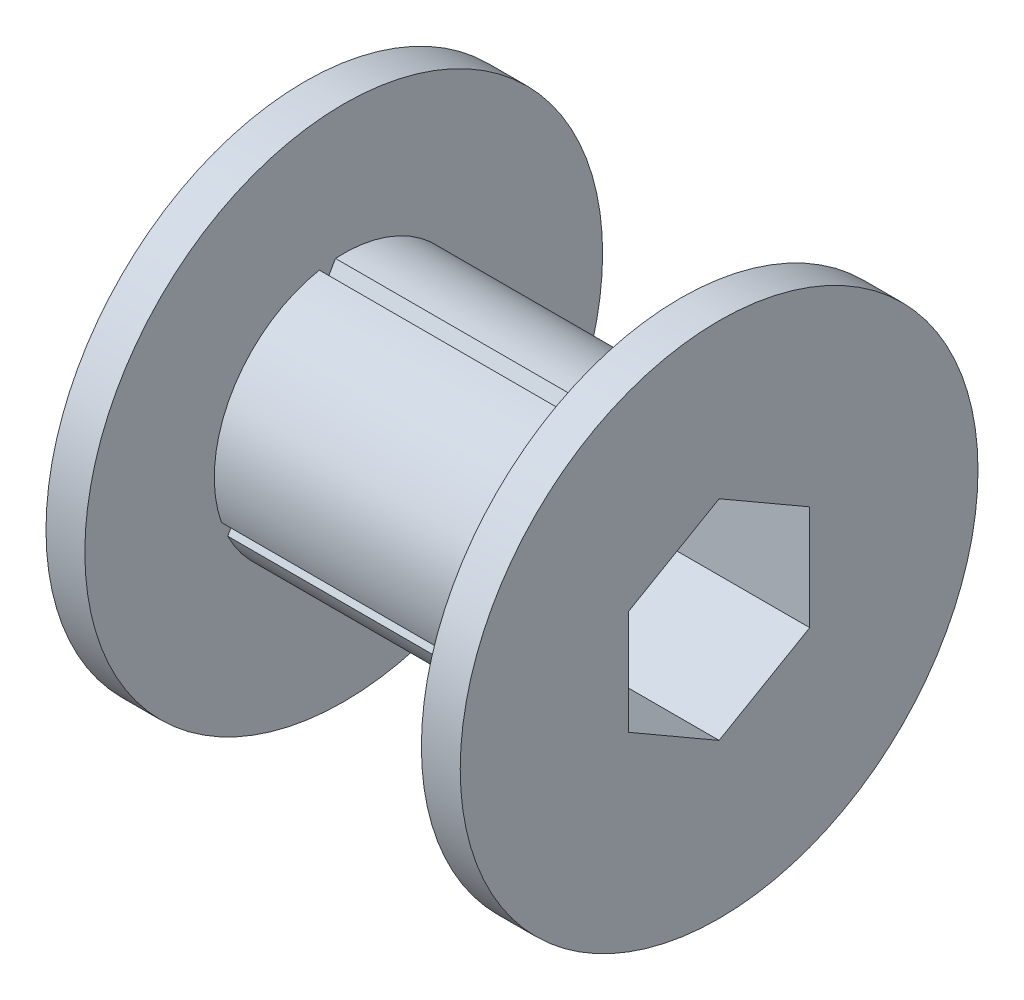
ISO-10303-21;
HEADER;
FILE_DESCRIPTION(('STEP AP214'),'2;1');
FILE_NAME('part.step','',(''),(''),'','','');
FILE_SCHEMA(('AUTOMOTIVE_DESIGN { 1 0 10303 214 1 1 1 1 }'));
ENDSEC;
DATA;
#1=APPLICATION_CONTEXT('core data for automotive mechanical design processes');
#2=APPLICATION_PROTOCOL_DEFINITION('international standard','automotive_design',2000,#1);
#3=PRODUCT_CONTEXT('',#1,'mechanical');
#4=PRODUCT('Part','Part','',(#3));
#5=PRODUCT_RELATED_PRODUCT_CATEGORY('part','',(#4));
#6=PRODUCT_DEFINITION_FORMATION('','',#4);
#7=PRODUCT_DEFINITION_CONTEXT('part definition',#1,'design');
#8=PRODUCT_DEFINITION('design','',#6,#7);
#9=PRODUCT_DEFINITION_SHAPE('','',#8);
#10=(LENGTH_UNIT() NAMED_UNIT(*) SI_UNIT(.MILLI.,.METRE.));
#11=(NAMED_UNIT(*) PLANE_ANGLE_UNIT() SI_UNIT($,.RADIAN.));
#12=(NAMED_UNIT(*) SI_UNIT($,.STERADIAN.) SOLID_ANGLE_UNIT());
#13=UNCERTAINTY_MEASURE_WITH_UNIT(LENGTH_MEASURE(1.E-05),#10,'distance_accuracy_value','');
#14=(GEOMETRIC_REPRESENTATION_CONTEXT(3) GLOBAL_UNCERTAINTY_ASSIGNED_CONTEXT((#13)) GLOBAL_UNIT_ASSIGNED_CONTEXT((#10,
#11,#12)) REPRESENTATION_CONTEXT('',''));
#15=CARTESIAN_POINT('',(0.,0.,0.));
#16=DIRECTION('',(0.,0.,1.));
#17=DIRECTION('',(1.,0.,0.));
#18=AXIS2_PLACEMENT_3D('',#15,#16,#17);
#19=CARTESIAN_POINT('',(4.,0.,0.));
#20=DIRECTION('',(-1.,0.,0.));
#21=DIRECTION('',(0.,0.,1.));
#22=AXIS2_PLACEMENT_3D('',#19,#20,#21);
#23=CYLINDRICAL_SURFACE('',#22,2.5);
#24=DIRECTION('',(-1.,0.,0.));
#25=VECTOR('',#24,1.);
#26=CARTESIAN_POINT('',(4.,2.49492372196933,0.159234486072311));
#27=LINE('',#26,#25);
#28=CARTESIAN_POINT('',(3.25,2.49492372196933,0.159234486072312));
#29=VERTEX_POINT('',#28);
#30=CARTESIAN_POINT('',(-3.25,2.49492372196933,0.159234486072311));
#31=VERTEX_POINT('',#30);
#32=EDGE_CURVE('E166',#29,#31,#27,.T.);
#33=ORIENTED_EDGE('',*,*,#32,.F.);
#34=CARTESIAN_POINT('',(3.25,0.,0.));
#35=DIRECTION('',(1.,0.,0.));
#36=DIRECTION('',(0.,0.,-1.));
#37=AXIS2_PLACEMENT_3D('',#34,#35,#36);
#38=CIRCLE('',#37,2.5);
#39=CARTESIAN_POINT('',(3.25,-1.10956075088748,2.24028456676602));
#40=VERTEX_POINT('',#39);
#41=EDGE_CURVE('E228',#40,#29,#38,.T.);
#42=ORIENTED_EDGE('',*,*,#41,.F.);
#43=DIRECTION('',(-1.,0.,0.));
#44=VECTOR('',#43,1.);
#45=CARTESIAN_POINT('',(4.,-1.10956075088748,2.24028456676602));
#46=LINE('',#45,#44);
#47=CARTESIAN_POINT('',(-3.25,-1.10956075088748,2.24028456676602));
#48=VERTEX_POINT('',#47);
#49=EDGE_CURVE('E160',#48,#40,#46,.F.);
#50=ORIENTED_EDGE('',*,*,#49,.F.);
#51=CARTESIAN_POINT('',(-3.25,0.,0.));
#52=DIRECTION('',(-1.,0.,0.));
#53=DIRECTION('',(0.,0.,1.));
#54=AXIS2_PLACEMENT_3D('',#51,#52,#53);
#55=CIRCLE('',#54,2.5);
#56=EDGE_CURVE('E235',#31,#48,#55,.T.);
#57=ORIENTED_EDGE('',*,*,#56,.F.);
#58=EDGE_LOOP('',(#33,#42,#50,#57));
#59=FACE_BOUND('',#58,.T.);
#60=ADVANCED_FACE('F33',(#59),#23,.T.);
#61=DIRECTION('',(-1.,0.,0.));
#62=VECTOR('',#61,1.);
#63=CARTESIAN_POINT('',(4.,-0.819905447910478,2.36172713421486));
#64=LINE('',#63,#62);
#65=CARTESIAN_POINT('',(3.25,-0.819905447910477,2.36172713421486));
#66=VERTEX_POINT('',#65);
#67=CARTESIAN_POINT('',(-3.25,-0.819905447910479,2.36172713421486));
#68=VERTEX_POINT('',#67);
#69=EDGE_CURVE('E158',#66,#68,#64,.T.);
#70=ORIENTED_EDGE('',*,*,#69,.F.);
#71=CARTESIAN_POINT('',(3.25,2.45526841899232,0.470804620515693));
#72=VERTEX_POINT('',#71);
#73=EDGE_CURVE('E151',#72,#66,#38,.T.);
#74=ORIENTED_EDGE('',*,*,#73,.F.);
#75=DIRECTION('',(-1.,0.,0.));
#76=VECTOR('',#75,1.);
#77=CARTESIAN_POINT('',(4.,2.45526841899233,0.470804620515692));
#78=LINE('',#77,#76);
#79=CARTESIAN_POINT('',(-3.25,2.45526841899233,0.470804620515692));
#80=VERTEX_POINT('',#79);
#81=EDGE_CURVE('E138',#80,#72,#78,.F.);
#82=ORIENTED_EDGE('',*,*,#81,.F.);
#83=EDGE_CURVE('E232',#68,#80,#55,.T.);
#84=ORIENTED_EDGE('',*,*,#83,.F.);
#85=EDGE_LOOP('',(#70,#74,#82,#84));
#86=FACE_BOUND('',#85,.T.);
#87=ADVANCED_FACE('F265',(#86),#23,.T.);
#88=CARTESIAN_POINT('',(-4.,0.,1.75));
#89=DIRECTION('',(0.,0.,1.));
#90=DIRECTION('',(0.,-1.,0.));
#91=AXIS2_PLACEMENT_3D('',#88,#89,#90);
#92=PLANE('',#91);
#93=DIRECTION('',(1.,0.,0.));
#94=VECTOR('',#93,1.);
#95=CARTESIAN_POINT('',(-4.,-1.01036297108192,1.75));
#96=LINE('',#95,#94);
#97=CARTESIAN_POINT('',(-4.,-1.01036297108192,1.75));
#98=VERTEX_POINT('',#97);
#99=CARTESIAN_POINT('',(4.,-1.01036297108192,1.75));
#100=VERTEX_POINT('',#99);
#101=EDGE_CURVE('E212',#98,#100,#96,.T.);
#102=ORIENTED_EDGE('',*,*,#101,.F.);
#103=DIRECTION('',(0.,-1.,0.));
#104=VECTOR('',#103,1.);
#105=CARTESIAN_POINT('',(-4.,1.01036297108184,1.75));
#106=LINE('',#105,#104);
#107=CARTESIAN_POINT('',(-4.,1.01036297108184,1.75));
#108=VERTEX_POINT('',#107);
#109=EDGE_CURVE('E196',#108,#98,#106,.T.);
#110=ORIENTED_EDGE('',*,*,#109,.F.);
#111=DIRECTION('',(1.,0.,0.));
#112=VECTOR('',#111,1.);
#113=CARTESIAN_POINT('',(-4.,1.01036297108184,1.75));
#114=LINE('',#113,#112);
#115=CARTESIAN_POINT('',(4.,1.01036297108184,1.75));
#116=VERTEX_POINT('',#115);
#117=EDGE_CURVE('E214',#108,#116,#114,.T.);
#118=ORIENTED_EDGE('',*,*,#117,.T.);
#119=DIRECTION('',(0.,-1.,0.));
#120=VECTOR('',#119,1.);
#121=CARTESIAN_POINT('',(4.,1.01036297108184,1.75));
#122=LINE('',#121,#120);
#123=EDGE_CURVE('E179',#116,#100,#122,.T.);
#124=ORIENTED_EDGE('',*,*,#123,.T.);
#125=EDGE_LOOP('',(#102,#110,#118,#124));
#126=FACE_BOUND('',#125,.T.);
#127=DIRECTION('',(0.,1.,0.));
#128=VECTOR('',#127,1.);
#129=CARTESIAN_POINT('',(-3.25,0.,1.75));
#130=LINE('',#129,#128);
#131=CARTESIAN_POINT('',(-3.25,-0.260362971081841,1.75));
#132=VERTEX_POINT('',#131);
#133=CARTESIAN_POINT('',(-3.25,0.239637028918158,1.75));
#134=VERTEX_POINT('',#133);
#135=EDGE_CURVE('E168',#132,#134,#130,.T.);
#136=ORIENTED_EDGE('',*,*,#135,.F.);
#137=DIRECTION('',(-1.,0.,0.));
#138=VECTOR('',#137,1.);
#139=CARTESIAN_POINT('',(-4.,-0.26036297108184,1.75));
#140=LINE('',#139,#138);
#141=CARTESIAN_POINT('',(3.25,-0.260362971081838,1.75));
#142=VERTEX_POINT('',#141);
#143=EDGE_CURVE('E157',#142,#132,#140,.T.);
#144=ORIENTED_EDGE('',*,*,#143,.F.);
#145=DIRECTION('',(0.,-1.,0.));
#146=VECTOR('',#145,1.);
#147=CARTESIAN_POINT('',(3.25,0.,1.75));
#148=LINE('',#147,#146);
#149=CARTESIAN_POINT('',(3.25,0.239637028918157,1.75));
#150=VERTEX_POINT('',#149);
#151=EDGE_CURVE('E147',#150,#142,#148,.T.);
#152=ORIENTED_EDGE('',*,*,#151,.F.);
#153=DIRECTION('',(1.,0.,0.));
#154=VECTOR('',#153,1.);
#155=CARTESIAN_POINT('',(-4.,0.239637028918158,1.75));
#156=LINE('',#155,#154);
#157=EDGE_CURVE('E130',#134,#150,#156,.T.);
#158=ORIENTED_EDGE('',*,*,#157,.F.);
#159=EDGE_LOOP('',(#136,#144,#152,#158));
#160=FACE_BOUND('',#159,.T.);
#161=ADVANCED_FACE('F156',(#126,#160),#92,.F.);
#162=CARTESIAN_POINT('',(-4.,1.51554445662277,0.875));
#163=DIRECTION('',(0.,0.866025403784438,0.5));
#164=DIRECTION('',(0.,-0.5,0.866025403784438));
#165=AXIS2_PLACEMENT_3D('',#162,#163,#164);
#166=PLANE('',#165);
#167=ORIENTED_EDGE('',*,*,#117,.F.);
#168=DIRECTION('',(0.,-0.5,0.866025403784439));
#169=VECTOR('',#168,1.);
#170=CARTESIAN_POINT('',(-4.,2.02072594216369,0.));
#171=LINE('',#170,#169);
#172=CARTESIAN_POINT('',(-4.,2.02072594216369,0.));
#173=VERTEX_POINT('',#172);
#174=EDGE_CURVE('E193',#173,#108,#171,.T.);
#175=ORIENTED_EDGE('',*,*,#174,.F.);
#176=DIRECTION('',(1.,0.,0.));
#177=VECTOR('',#176,1.);
#178=CARTESIAN_POINT('',(-4.,2.02072594216369,0.));
#179=LINE('',#178,#177);
#180=CARTESIAN_POINT('',(4.,2.02072594216369,0.));
#181=VERTEX_POINT('',#180);
#182=EDGE_CURVE('E216',#173,#181,#179,.T.);
#183=ORIENTED_EDGE('',*,*,#182,.T.);
#184=DIRECTION('',(0.,-0.5,0.866025403784439));
#185=VECTOR('',#184,1.);
#186=CARTESIAN_POINT('',(4.,2.02072594216369,0.));
#187=LINE('',#186,#185);
#188=EDGE_CURVE('E176',#181,#116,#187,.T.);
#189=ORIENTED_EDGE('',*,*,#188,.T.);
#190=EDGE_LOOP('',(#167,#175,#183,#189));
#191=FACE_BOUND('',#190,.T.);
#192=DIRECTION('',(0.,0.5,-0.866025403784438));
#193=VECTOR('',#192,1.);
#194=CARTESIAN_POINT('',(-3.25,1.51554445662277,0.875));
#195=LINE('',#194,#193);
#196=CARTESIAN_POINT('',(-3.25,1.39572594216369,1.08253175473055));
#197=VERTEX_POINT('',#196);
#198=CARTESIAN_POINT('',(-3.25,1.64572594216369,0.64951905283833));
#199=VERTEX_POINT('',#198);
#200=EDGE_CURVE('E11',#197,#199,#195,.T.);
#201=ORIENTED_EDGE('',*,*,#200,.F.);
#202=DIRECTION('',(-1.,0.,0.));
#203=VECTOR('',#202,1.);
#204=CARTESIAN_POINT('',(-4.,1.39572594216369,1.08253175473055));
#205=LINE('',#204,#203);
#206=CARTESIAN_POINT('',(3.25,1.39572594216369,1.08253175473055));
#207=VERTEX_POINT('',#206);
#208=EDGE_CURVE('E236',#207,#197,#205,.T.);
#209=ORIENTED_EDGE('',*,*,#208,.F.);
#210=DIRECTION('',(0.,-0.5,0.866025403784438));
#211=VECTOR('',#210,1.);
#212=CARTESIAN_POINT('',(3.25,1.51554445662277,0.875));
#213=LINE('',#212,#211);
#214=CARTESIAN_POINT('',(3.25,1.64572594216369,0.649519052838333));
#215=VERTEX_POINT('',#214);
#216=EDGE_CURVE('E238',#215,#207,#213,.T.);
#217=ORIENTED_EDGE('',*,*,#216,.F.);
#218=DIRECTION('',(1.,0.,0.));
#219=VECTOR('',#218,1.);
#220=CARTESIAN_POINT('',(-4.,1.64572594216369,0.649519052838329));
#221=LINE('',#220,#219);
#222=EDGE_CURVE('E40',#199,#215,#221,.T.);
#223=ORIENTED_EDGE('',*,*,#222,.F.);
#224=EDGE_LOOP('',(#201,#209,#217,#223));
#225=FACE_BOUND('',#224,.T.);
#226=ADVANCED_FACE('F255',(#191,#225),#166,.F.);
#227=CARTESIAN_POINT('',(3.25,0.,0.));
#228=DIRECTION('',(1.,0.,0.));
#229=DIRECTION('',(0.,0.,-1.));
#230=AXIS2_PLACEMENT_3D('',#227,#228,#229);
#231=CYLINDRICAL_SURFACE('',#230,5.);
#232=CARTESIAN_POINT('',(3.25,0.,0.));
#233=DIRECTION('',(1.,0.,0.));
#234=DIRECTION('',(0.,0.,-1.));
#235=AXIS2_PLACEMENT_3D('',#232,#233,#234);
#236=CIRCLE('',#235,5.);
#237=CARTESIAN_POINT('',(3.25,0.,-5.));
#238=VERTEX_POINT('',#237);
#239=EDGE_CURVE('E225',#238,#238,#236,.T.);
#240=ORIENTED_EDGE('',*,*,#239,.T.);
#241=EDGE_LOOP('',(#240));
#242=FACE_BOUND('',#241,.T.);
#243=CARTESIAN_POINT('',(4.,0.,0.));
#244=DIRECTION('',(1.,0.,0.));
#245=DIRECTION('',(0.,0.,-1.));
#246=AXIS2_PLACEMENT_3D('',#243,#244,#245);
#247=CIRCLE('',#246,5.);
#248=CARTESIAN_POINT('',(4.,0.,-5.));
#249=VERTEX_POINT('',#248);
#250=EDGE_CURVE('E222',#249,#249,#247,.T.);
#251=ORIENTED_EDGE('',*,*,#250,.F.);
#252=EDGE_LOOP('',(#251));
#253=FACE_BOUND('',#252,.T.);
#254=ADVANCED_FACE('F284',(#242,#253),#231,.T.);
#255=CARTESIAN_POINT('',(3.25,0.,0.));
#256=DIRECTION('',(1.,0.,0.));
#257=DIRECTION('',(0.,0.,-1.));
#258=AXIS2_PLACEMENT_3D('',#255,#256,#257);
#259=PLANE('',#258);
#260=ORIENTED_EDGE('',*,*,#41,.T.);
#261=DIRECTION('',(0.,0.866025403784438,-0.500000000000001));
#262=VECTOR('',#261,1.);
#263=CARTESIAN_POINT('',(3.25,-5.22238202392017,4.61482303588027));
#264=LINE('',#263,#262);
#265=EDGE_CURVE('E152',#215,#29,#264,.T.);
#266=ORIENTED_EDGE('',*,*,#265,.F.);
#267=ORIENTED_EDGE('',*,*,#216,.T.);
#268=DIRECTION('',(0.,0.866025403784438,-0.500000000000001));
#269=VECTOR('',#268,1.);
#270=CARTESIAN_POINT('',(3.25,-5.09738202392017,4.83132938682638));
#271=LINE('',#270,#269);
#272=EDGE_CURVE('E153',#207,#72,#271,.T.);
#273=ORIENTED_EDGE('',*,*,#272,.T.);
#274=ORIENTED_EDGE('',*,*,#73,.T.);
#275=EDGE_CURVE('E47',#66,#150,#271,.T.);
#276=ORIENTED_EDGE('',*,*,#275,.T.);
#277=ORIENTED_EDGE('',*,*,#151,.T.);
#278=EDGE_CURVE('E253',#40,#142,#264,.T.);
#279=ORIENTED_EDGE('',*,*,#278,.F.);
#280=EDGE_LOOP('',(#260,#266,#267,#273,#274,#276,#277,#279));
#281=FACE_BOUND('',#280,.T.);
#282=ORIENTED_EDGE('',*,*,#239,.F.);
#283=EDGE_LOOP('',(#282));
#284=FACE_BOUND('',#283,.T.);
#285=ADVANCED_FACE('F144',(#281,#284),#259,.F.);
#286=CARTESIAN_POINT('',(4.,0.,0.));
#287=DIRECTION('',(1.,0.,0.));
#288=DIRECTION('',(0.,0.,-1.));
#289=AXIS2_PLACEMENT_3D('',#286,#287,#288);
#290=PLANE('',#289);
#291=DIRECTION('',(0.,0.5,-0.866025403784438));
#292=VECTOR('',#291,1.);
#293=CARTESIAN_POINT('',(4.,-2.02072594216369,0.));
#294=LINE('',#293,#292);
#295=CARTESIAN_POINT('',(4.,-2.02072594216369,0.));
#296=VERTEX_POINT('',#295);
#297=CARTESIAN_POINT('',(4.,-1.01036297108185,-1.75));
#298=VERTEX_POINT('',#297);
#299=EDGE_CURVE('E185',#296,#298,#294,.T.);
#300=ORIENTED_EDGE('',*,*,#299,.F.);
#301=DIRECTION('',(0.,-0.499999999999944,-0.866025403784471));
#302=VECTOR('',#301,1.);
#303=CARTESIAN_POINT('',(4.,-1.01036297108192,1.75));
#304=LINE('',#303,#302);
#305=EDGE_CURVE('E182',#100,#296,#304,.T.);
#306=ORIENTED_EDGE('',*,*,#305,.F.);
#307=ORIENTED_EDGE('',*,*,#123,.F.);
#308=ORIENTED_EDGE('',*,*,#188,.F.);
#309=DIRECTION('',(0.,0.5,0.866025403784439));
#310=VECTOR('',#309,1.);
#311=CARTESIAN_POINT('',(4.,1.01036297108184,-1.75));
#312=LINE('',#311,#310);
#313=CARTESIAN_POINT('',(4.,1.01036297108184,-1.75));
#314=VERTEX_POINT('',#313);
#315=EDGE_CURVE('E173',#314,#181,#312,.T.);
#316=ORIENTED_EDGE('',*,*,#315,.F.);
#317=DIRECTION('',(0.,1.,0.));
#318=VECTOR('',#317,1.);
#319=CARTESIAN_POINT('',(4.,-1.01036297108185,-1.75));
#320=LINE('',#319,#318);
#321=EDGE_CURVE('E170',#298,#314,#320,.T.);
#322=ORIENTED_EDGE('',*,*,#321,.F.);
#323=EDGE_LOOP('',(#300,#306,#307,#308,#316,#322));
#324=FACE_BOUND('',#323,.T.);
#325=ORIENTED_EDGE('',*,*,#250,.T.);
#326=EDGE_LOOP('',(#325));
#327=FACE_BOUND('',#326,.T.);
#328=ADVANCED_FACE('F305',(#324,#327),#290,.T.);
#329=CARTESIAN_POINT('',(-3.25,0.,0.));
#330=DIRECTION('',(-1.,0.,0.));
#331=DIRECTION('',(0.,0.,1.));
#332=AXIS2_PLACEMENT_3D('',#329,#330,#331);
#333=CYLINDRICAL_SURFACE('',#332,5.);
#334=CARTESIAN_POINT('',(-3.25,0.,0.));
#335=DIRECTION('',(1.,0.,0.));
#336=DIRECTION('',(0.,0.,-1.));
#337=AXIS2_PLACEMENT_3D('',#334,#335,#336);
#338=CIRCLE('',#337,5.);
#339=CARTESIAN_POINT('',(-3.25,0.,-5.));
#340=VERTEX_POINT('',#339);
#341=EDGE_CURVE('E219',#340,#340,#338,.T.);
#342=ORIENTED_EDGE('',*,*,#341,.F.);
#343=EDGE_LOOP('',(#342));
#344=FACE_BOUND('',#343,.T.);
#345=CARTESIAN_POINT('',(-4.,0.,0.));
#346=DIRECTION('',(1.,0.,0.));
#347=DIRECTION('',(0.,0.,-1.));
#348=AXIS2_PLACEMENT_3D('',#345,#346,#347);
#349=CIRCLE('',#348,5.);
#350=CARTESIAN_POINT('',(-4.,0.,-5.));
#351=VERTEX_POINT('',#350);
#352=EDGE_CURVE('E209',#351,#351,#349,.T.);
#353=ORIENTED_EDGE('',*,*,#352,.T.);
#354=EDGE_LOOP('',(#353));
#355=FACE_BOUND('',#354,.T.);
#356=ADVANCED_FACE('F302',(#344,#355),#333,.T.);
#357=CARTESIAN_POINT('',(-3.25,0.,0.));
#358=DIRECTION('',(-1.,0.,0.));
#359=DIRECTION('',(0.,0.,-1.));
#360=AXIS2_PLACEMENT_3D('',#357,#358,#359);
#361=PLANE('',#360);
#362=ORIENTED_EDGE('',*,*,#56,.T.);
#363=DIRECTION('',(0.,0.866025403784438,-0.500000000000001));
#364=VECTOR('',#363,1.);
#365=CARTESIAN_POINT('',(-3.25,-5.22238202392017,4.61482303588027));
#366=LINE('',#365,#364);
#367=EDGE_CURVE('E139',#48,#132,#366,.T.);
#368=ORIENTED_EDGE('',*,*,#367,.T.);
#369=ORIENTED_EDGE('',*,*,#135,.T.);
#370=DIRECTION('',(0.,0.866025403784438,-0.500000000000001));
#371=VECTOR('',#370,1.);
#372=CARTESIAN_POINT('',(-3.25,-5.09738202392017,4.83132938682638));
#373=LINE('',#372,#371);
#374=EDGE_CURVE('E133',#68,#134,#373,.T.);
#375=ORIENTED_EDGE('',*,*,#374,.F.);
#376=ORIENTED_EDGE('',*,*,#83,.T.);
#377=EDGE_CURVE('E55',#197,#80,#373,.T.);
#378=ORIENTED_EDGE('',*,*,#377,.F.);
#379=ORIENTED_EDGE('',*,*,#200,.T.);
#380=EDGE_CURVE('E247',#199,#31,#366,.T.);
#381=ORIENTED_EDGE('',*,*,#380,.T.);
#382=EDGE_LOOP('',(#362,#368,#369,#375,#376,#378,#379,#381));
#383=FACE_BOUND('',#382,.T.);
#384=ORIENTED_EDGE('',*,*,#341,.T.);
#385=EDGE_LOOP('',(#384));
#386=FACE_BOUND('',#385,.T.);
#387=ADVANCED_FACE('F259',(#383,#386),#361,.F.);
#388=CARTESIAN_POINT('',(-4.,0.,0.));
#389=DIRECTION('',(1.,0.,0.));
#390=DIRECTION('',(0.,0.,-1.));
#391=AXIS2_PLACEMENT_3D('',#388,#389,#390);
#392=PLANE('',#391);
#393=DIRECTION('',(0.,-0.499999999999944,-0.866025403784471));
#394=VECTOR('',#393,1.);
#395=CARTESIAN_POINT('',(-4.,-1.01036297108192,1.75));
#396=LINE('',#395,#394);
#397=CARTESIAN_POINT('',(-4.,-2.02072594216369,0.));
#398=VERTEX_POINT('',#397);
#399=EDGE_CURVE('E199',#98,#398,#396,.T.);
#400=ORIENTED_EDGE('',*,*,#399,.T.);
#401=DIRECTION('',(0.,0.5,-0.866025403784438));
#402=VECTOR('',#401,1.);
#403=CARTESIAN_POINT('',(-4.,-2.02072594216369,0.));
#404=LINE('',#403,#402);
#405=CARTESIAN_POINT('',(-4.,-1.01036297108185,-1.75));
#406=VERTEX_POINT('',#405);
#407=EDGE_CURVE('E202',#398,#406,#404,.T.);
#408=ORIENTED_EDGE('',*,*,#407,.T.);
#409=DIRECTION('',(0.,1.,0.));
#410=VECTOR('',#409,1.);
#411=CARTESIAN_POINT('',(-4.,-1.01036297108185,-1.75));
#412=LINE('',#411,#410);
#413=CARTESIAN_POINT('',(-4.,1.01036297108184,-1.75));
#414=VERTEX_POINT('',#413);
#415=EDGE_CURVE('E187',#406,#414,#412,.T.);
#416=ORIENTED_EDGE('',*,*,#415,.T.);
#417=DIRECTION('',(0.,0.5,0.866025403784439));
#418=VECTOR('',#417,1.);
#419=CARTESIAN_POINT('',(-4.,1.01036297108184,-1.75));
#420=LINE('',#419,#418);
#421=EDGE_CURVE('E190',#414,#173,#420,.T.);
#422=ORIENTED_EDGE('',*,*,#421,.T.);
#423=ORIENTED_EDGE('',*,*,#174,.T.);
#424=ORIENTED_EDGE('',*,*,#109,.T.);
#425=EDGE_LOOP('',(#400,#408,#416,#422,#423,#424));
#426=FACE_BOUND('',#425,.T.);
#427=ORIENTED_EDGE('',*,*,#352,.F.);
#428=EDGE_LOOP('',(#427));
#429=FACE_BOUND('',#428,.T.);
#430=ADVANCED_FACE('F301',(#426,#429),#392,.F.);
#431=CARTESIAN_POINT('',(-4.,-1.51554445662277,-0.875));
#432=DIRECTION('',(0.,-0.866025403784439,-0.5));
#433=DIRECTION('',(0.,0.5,-0.866025403784439));
#434=AXIS2_PLACEMENT_3D('',#431,#432,#433);
#435=PLANE('',#434);
#436=DIRECTION('',(1.,0.,0.));
#437=VECTOR('',#436,1.);
#438=CARTESIAN_POINT('',(-4.,-1.01036297108185,-1.75));
#439=LINE('',#438,#437);
#440=EDGE_CURVE('E206',#406,#298,#439,.T.);
#441=ORIENTED_EDGE('',*,*,#440,.F.);
#442=ORIENTED_EDGE('',*,*,#407,.F.);
#443=DIRECTION('',(1.,0.,0.));
#444=VECTOR('',#443,1.);
#445=CARTESIAN_POINT('',(-4.,-2.02072594216369,0.));
#446=LINE('',#445,#444);
#447=EDGE_CURVE('E210',#398,#296,#446,.T.);
#448=ORIENTED_EDGE('',*,*,#447,.T.);
#449=ORIENTED_EDGE('',*,*,#299,.T.);
#450=EDGE_LOOP('',(#441,#442,#448,#449));
#451=FACE_BOUND('',#450,.T.);
#452=ADVANCED_FACE('F315',(#451),#435,.F.);
#453=CARTESIAN_POINT('',(-4.,-1.51554445662277,0.874999999999992));
#454=DIRECTION('',(0.,-0.866025403784439,0.5));
#455=DIRECTION('',(0.,-0.5,-0.866025403784439));
#456=AXIS2_PLACEMENT_3D('',#453,#454,#455);
#457=PLANE('',#456);
#458=ORIENTED_EDGE('',*,*,#447,.F.);
#459=ORIENTED_EDGE('',*,*,#399,.F.);
#460=ORIENTED_EDGE('',*,*,#101,.T.);
#461=ORIENTED_EDGE('',*,*,#305,.T.);
#462=EDGE_LOOP('',(#458,#459,#460,#461));
#463=FACE_BOUND('',#462,.T.);
#464=ADVANCED_FACE('F288',(#463),#457,.F.);
#465=CARTESIAN_POINT('',(-4.,1.51554445662277,-0.875));
#466=DIRECTION('',(0.,0.866025403784438,-0.500000000000001));
#467=DIRECTION('',(0.,0.500000000000001,0.866025403784438));
#468=AXIS2_PLACEMENT_3D('',#465,#466,#467);
#469=PLANE('',#468);
#470=ORIENTED_EDGE('',*,*,#182,.F.);
#471=ORIENTED_EDGE('',*,*,#421,.F.);
#472=DIRECTION('',(1.,0.,0.));
#473=VECTOR('',#472,1.);
#474=CARTESIAN_POINT('',(-4.,1.01036297108184,-1.75));
#475=LINE('',#474,#473);
#476=EDGE_CURVE('E205',#414,#314,#475,.T.);
#477=ORIENTED_EDGE('',*,*,#476,.T.);
#478=ORIENTED_EDGE('',*,*,#315,.T.);
#479=EDGE_LOOP('',(#470,#471,#477,#478));
#480=FACE_BOUND('',#479,.T.);
#481=ADVANCED_FACE('F291',(#480),#469,.F.);
#482=CARTESIAN_POINT('',(-4.,0.,-1.75));
#483=DIRECTION('',(0.,0.,-1.));
#484=DIRECTION('',(-1.,0.,0.));
#485=AXIS2_PLACEMENT_3D('',#482,#483,#484);
#486=PLANE('',#485);
#487=ORIENTED_EDGE('',*,*,#476,.F.);
#488=ORIENTED_EDGE('',*,*,#415,.F.);
#489=ORIENTED_EDGE('',*,*,#440,.T.);
#490=ORIENTED_EDGE('',*,*,#321,.T.);
#491=EDGE_LOOP('',(#487,#488,#489,#490));
#492=FACE_BOUND('',#491,.T.);
#493=ADVANCED_FACE('F294',(#492),#486,.F.);
#494=CARTESIAN_POINT('',(3.25,-5.09738202392017,4.83132938682638));
#495=DIRECTION('',(0.,-0.500000000000001,-0.866025403784438));
#496=DIRECTION('',(0.,0.866025403784438,-0.500000000000001));
#497=AXIS2_PLACEMENT_3D('',#494,#495,#496);
#498=PLANE('',#497);
#499=ORIENTED_EDGE('',*,*,#81,.T.);
#500=ORIENTED_EDGE('',*,*,#272,.F.);
#501=ORIENTED_EDGE('',*,*,#208,.T.);
#502=ORIENTED_EDGE('',*,*,#377,.T.);
#503=EDGE_LOOP('',(#499,#500,#501,#502));
#504=FACE_BOUND('',#503,.T.);
#505=ADVANCED_FACE('F256',(#504),#498,.T.);
#506=CARTESIAN_POINT('',(3.25,-5.22238202392017,4.61482303588027));
#507=DIRECTION('',(0.,0.500000000000001,0.866025403784438));
#508=DIRECTION('',(0.,-0.866025403784438,0.500000000000001));
#509=AXIS2_PLACEMENT_3D('',#506,#507,#508);
#510=PLANE('',#509);
#511=ORIENTED_EDGE('',*,*,#32,.T.);
#512=ORIENTED_EDGE('',*,*,#380,.F.);
#513=ORIENTED_EDGE('',*,*,#222,.T.);
#514=ORIENTED_EDGE('',*,*,#265,.T.);
#515=EDGE_LOOP('',(#511,#512,#513,#514));
#516=FACE_BOUND('',#515,.T.);
#517=ADVANCED_FACE('F244',(#516),#510,.T.);
#518=ORIENTED_EDGE('',*,*,#49,.T.);
#519=ORIENTED_EDGE('',*,*,#278,.T.);
#520=ORIENTED_EDGE('',*,*,#143,.T.);
#521=ORIENTED_EDGE('',*,*,#367,.F.);
#522=EDGE_LOOP('',(#518,#519,#520,#521));
#523=FACE_BOUND('',#522,.T.);
#524=ADVANCED_FACE('F270',(#523),#510,.T.);
#525=ORIENTED_EDGE('',*,*,#69,.T.);
#526=ORIENTED_EDGE('',*,*,#374,.T.);
#527=ORIENTED_EDGE('',*,*,#157,.T.);
#528=ORIENTED_EDGE('',*,*,#275,.F.);
#529=EDGE_LOOP('',(#525,#526,#527,#528));
#530=FACE_BOUND('',#529,.T.);
#531=ADVANCED_FACE('F131',(#530),#498,.T.);
#532=CLOSED_SHELL('',(#60,#87,#161,#226,#254,#285,#328,#356,#387,#430,#452,#464,#481,#493,#505,
#517,#524,#531));
#533=MANIFOLD_SOLID_BREP('B2',#532);
#534=ADVANCED_BREP_SHAPE_REPRESENTATION('',(#18,#533),#14);
#535=SHAPE_DEFINITION_REPRESENTATION(#9,#534);
ENDSEC;
END-ISO-10303-21;
